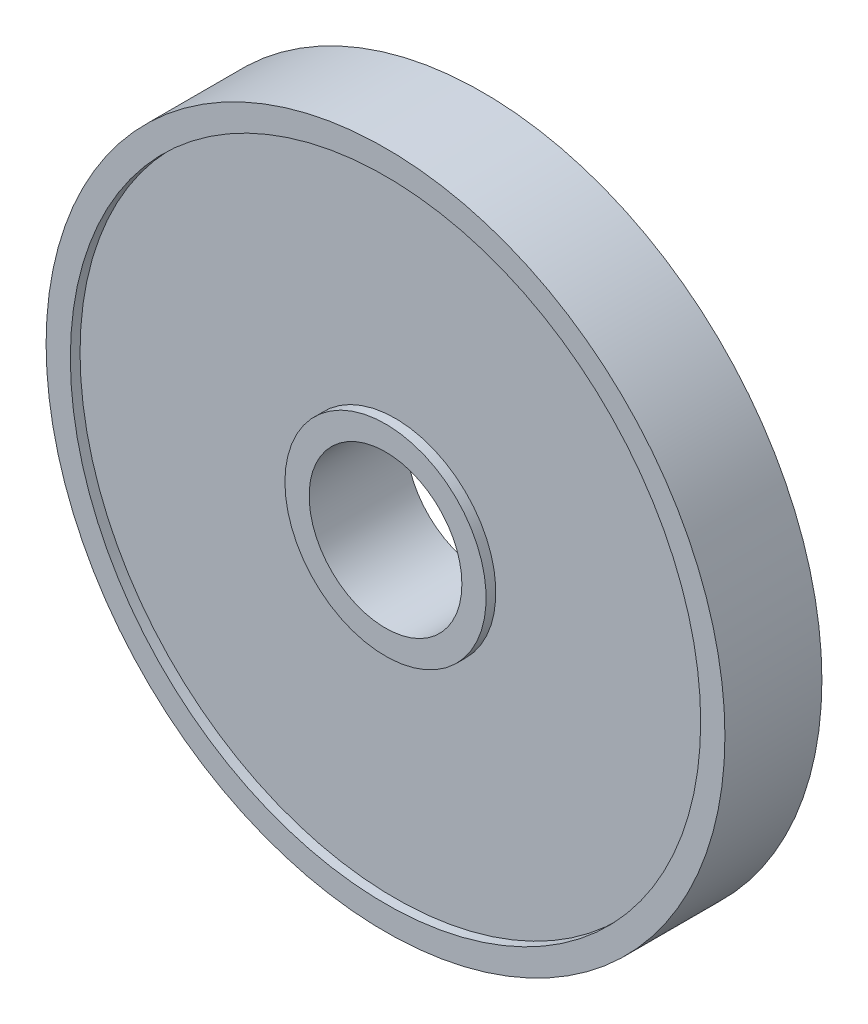
ISO-10303-21;
HEADER;
FILE_DESCRIPTION(('STEP AP214'),'2;1');
FILE_NAME('part.step','',(''),(''),'','','');
FILE_SCHEMA(('AUTOMOTIVE_DESIGN { 1 0 10303 214 1 1 1 1 }'));
ENDSEC;
DATA;
#1=APPLICATION_CONTEXT('core data for automotive mechanical design processes');
#2=APPLICATION_PROTOCOL_DEFINITION('international standard','automotive_design',2000,#1);
#3=PRODUCT_CONTEXT('',#1,'mechanical');
#4=PRODUCT('Part','Part','',(#3));
#5=PRODUCT_RELATED_PRODUCT_CATEGORY('part','',(#4));
#6=PRODUCT_DEFINITION_FORMATION('','',#4);
#7=PRODUCT_DEFINITION_CONTEXT('part definition',#1,'design');
#8=PRODUCT_DEFINITION('design','',#6,#7);
#9=PRODUCT_DEFINITION_SHAPE('','',#8);
#10=(LENGTH_UNIT() NAMED_UNIT(*) SI_UNIT(.MILLI.,.METRE.));
#11=(NAMED_UNIT(*) PLANE_ANGLE_UNIT() SI_UNIT($,.RADIAN.));
#12=(NAMED_UNIT(*) SI_UNIT($,.STERADIAN.) SOLID_ANGLE_UNIT());
#13=UNCERTAINTY_MEASURE_WITH_UNIT(LENGTH_MEASURE(1.E-05),#10,'distance_accuracy_value','');
#14=(GEOMETRIC_REPRESENTATION_CONTEXT(3) GLOBAL_UNCERTAINTY_ASSIGNED_CONTEXT((#13)) GLOBAL_UNIT_ASSIGNED_CONTEXT((#10,
#11,#12)) REPRESENTATION_CONTEXT('',''));
#15=CARTESIAN_POINT('',(0.,0.,0.));
#16=DIRECTION('',(0.,0.,1.));
#17=DIRECTION('',(1.,0.,0.));
#18=AXIS2_PLACEMENT_3D('',#15,#16,#17);
#19=CARTESIAN_POINT('',(0.,0.,20.));
#20=DIRECTION('',(0.,0.,1.));
#21=DIRECTION('',(1.,0.,0.));
#22=AXIS2_PLACEMENT_3D('',#19,#20,#21);
#23=PLANE('',#22);
#24=CARTESIAN_POINT('',(0.,0.,20.));
#25=DIRECTION('',(0.,0.,-1.));
#26=DIRECTION('',(-1.,0.,0.));
#27=AXIS2_PLACEMENT_3D('',#24,#25,#26);
#28=CIRCLE('',#27,20.75);
#29=CARTESIAN_POINT('',(-20.75,0.,20.));
#30=VERTEX_POINT('',#29);
#31=EDGE_CURVE('E51',#30,#30,#28,.T.);
#32=ORIENTED_EDGE('',*,*,#31,.F.);
#33=EDGE_LOOP('',(#32));
#34=FACE_BOUND('',#33,.T.);
#35=CARTESIAN_POINT('',(0.,0.,20.));
#36=DIRECTION('',(0.,0.,1.));
#37=DIRECTION('',(1.,0.,0.));
#38=AXIS2_PLACEMENT_3D('',#35,#36,#37);
#39=CIRCLE('',#38,15.75);
#40=CARTESIAN_POINT('',(15.75,0.,20.));
#41=VERTEX_POINT('',#40);
#42=EDGE_CURVE('E46',#41,#41,#39,.T.);
#43=ORIENTED_EDGE('',*,*,#42,.F.);
#44=EDGE_LOOP('',(#43));
#45=FACE_BOUND('',#44,.T.);
#46=ADVANCED_FACE('F32',(#34,#45),#23,.T.);
#47=CARTESIAN_POINT('',(0.,0.,0.));
#48=DIRECTION('',(0.,0.,1.));
#49=DIRECTION('',(1.,0.,0.));
#50=AXIS2_PLACEMENT_3D('',#47,#48,#49);
#51=PLANE('',#50);
#52=CARTESIAN_POINT('',(0.,0.,0.));
#53=DIRECTION('',(0.,0.,-1.));
#54=DIRECTION('',(-1.,0.,0.));
#55=AXIS2_PLACEMENT_3D('',#52,#53,#54);
#56=CIRCLE('',#55,20.75);
#57=CARTESIAN_POINT('',(-20.75,0.,0.));
#58=VERTEX_POINT('',#57);
#59=EDGE_CURVE('E59',#58,#58,#56,.T.);
#60=ORIENTED_EDGE('',*,*,#59,.T.);
#61=EDGE_LOOP('',(#60));
#62=FACE_BOUND('',#61,.T.);
#63=CARTESIAN_POINT('',(0.,0.,0.));
#64=DIRECTION('',(0.,0.,1.));
#65=DIRECTION('',(1.,0.,0.));
#66=AXIS2_PLACEMENT_3D('',#63,#64,#65);
#67=CIRCLE('',#66,15.75);
#68=CARTESIAN_POINT('',(15.75,0.,0.));
#69=VERTEX_POINT('',#68);
#70=EDGE_CURVE('E48',#69,#69,#67,.T.);
#71=ORIENTED_EDGE('',*,*,#70,.T.);
#72=EDGE_LOOP('',(#71));
#73=FACE_BOUND('',#72,.T.);
#74=ADVANCED_FACE('F91',(#62,#73),#51,.F.);
#75=CARTESIAN_POINT('',(0.,0.,20.));
#76=DIRECTION('',(0.,0.,-1.));
#77=DIRECTION('',(-1.,0.,0.));
#78=AXIS2_PLACEMENT_3D('',#75,#76,#77);
#79=CYLINDRICAL_SURFACE('',#78,15.75);
#80=ORIENTED_EDGE('',*,*,#42,.T.);
#81=EDGE_LOOP('',(#80));
#82=FACE_BOUND('',#81,.T.);
#83=ORIENTED_EDGE('',*,*,#70,.F.);
#84=EDGE_LOOP('',(#83));
#85=FACE_BOUND('',#84,.T.);
#86=ADVANCED_FACE('F96',(#82,#85),#79,.F.);
#87=CARTESIAN_POINT('',(0.,65.,2.));
#88=DIRECTION('',(0.,0.,1.));
#89=DIRECTION('',(1.,0.,0.));
#90=AXIS2_PLACEMENT_3D('',#87,#88,#89);
#91=PLANE('',#90);
#92=CARTESIAN_POINT('',(0.,0.,1.99999999999999));
#93=DIRECTION('',(0.,0.,-1.));
#94=DIRECTION('',(-1.,0.,0.));
#95=AXIS2_PLACEMENT_3D('',#92,#93,#94);
#96=CIRCLE('',#95,20.75);
#97=CARTESIAN_POINT('',(-20.75,0.,1.99999999999999));
#98=VERTEX_POINT('',#97);
#99=EDGE_CURVE('E55',#98,#98,#96,.T.);
#100=ORIENTED_EDGE('',*,*,#99,.F.);
#101=EDGE_LOOP('',(#100));
#102=FACE_BOUND('',#101,.T.);
#103=CARTESIAN_POINT('',(0.,0.,2.00000000000001));
#104=DIRECTION('',(0.,0.,-1.));
#105=DIRECTION('',(-1.,0.,0.));
#106=AXIS2_PLACEMENT_3D('',#103,#104,#105);
#107=CIRCLE('',#106,65.);
#108=CARTESIAN_POINT('',(-65.,0.,2.00000000000001));
#109=VERTEX_POINT('',#108);
#110=EDGE_CURVE('E65',#109,#109,#107,.T.);
#111=ORIENTED_EDGE('',*,*,#110,.T.);
#112=EDGE_LOOP('',(#111));
#113=FACE_BOUND('',#112,.T.);
#114=ADVANCED_FACE('F99',(#102,#113),#91,.F.);
#115=CARTESIAN_POINT('',(0.,0.,0.));
#116=DIRECTION('',(0.,0.,-1.));
#117=DIRECTION('',(-1.,0.,0.));
#118=AXIS2_PLACEMENT_3D('',#115,#116,#117);
#119=CYLINDRICAL_SURFACE('',#118,20.75);
#120=ORIENTED_EDGE('',*,*,#59,.F.);
#121=EDGE_LOOP('',(#120));
#122=FACE_BOUND('',#121,.T.);
#123=ORIENTED_EDGE('',*,*,#99,.T.);
#124=EDGE_LOOP('',(#123));
#125=FACE_BOUND('',#124,.T.);
#126=ADVANCED_FACE('F120',(#122,#125),#119,.T.);
#127=CARTESIAN_POINT('',(0.,0.,0.));
#128=DIRECTION('',(0.,0.,-1.));
#129=DIRECTION('',(-1.,0.,0.));
#130=AXIS2_PLACEMENT_3D('',#127,#128,#129);
#131=CYLINDRICAL_SURFACE('',#130,65.);
#132=ORIENTED_EDGE('',*,*,#110,.F.);
#133=EDGE_LOOP('',(#132));
#134=FACE_BOUND('',#133,.T.);
#135=CARTESIAN_POINT('',(0.,0.,0.));
#136=DIRECTION('',(0.,0.,-1.));
#137=DIRECTION('',(-1.,0.,0.));
#138=AXIS2_PLACEMENT_3D('',#135,#136,#137);
#139=CIRCLE('',#138,65.);
#140=CARTESIAN_POINT('',(-65.,0.,0.));
#141=VERTEX_POINT('',#140);
#142=EDGE_CURVE('E62',#141,#141,#139,.T.);
#143=ORIENTED_EDGE('',*,*,#142,.T.);
#144=EDGE_LOOP('',(#143));
#145=FACE_BOUND('',#144,.T.);
#146=ADVANCED_FACE('F85',(#134,#145),#131,.F.);
#147=CARTESIAN_POINT('',(0.,0.,0.));
#148=DIRECTION('',(0.,0.,-1.));
#149=DIRECTION('',(-1.,0.,0.));
#150=AXIS2_PLACEMENT_3D('',#147,#148,#149);
#151=CYLINDRICAL_SURFACE('',#150,20.75);
#152=CARTESIAN_POINT('',(0.,0.,18.));
#153=DIRECTION('',(0.,0.,-1.));
#154=DIRECTION('',(-1.,0.,0.));
#155=AXIS2_PLACEMENT_3D('',#152,#153,#154);
#156=CIRCLE('',#155,20.75);
#157=CARTESIAN_POINT('',(-20.75,0.,18.));
#158=VERTEX_POINT('',#157);
#159=EDGE_CURVE('E58',#158,#158,#156,.T.);
#160=ORIENTED_EDGE('',*,*,#159,.F.);
#161=EDGE_LOOP('',(#160));
#162=FACE_BOUND('',#161,.T.);
#163=ORIENTED_EDGE('',*,*,#31,.T.);
#164=EDGE_LOOP('',(#163));
#165=FACE_BOUND('',#164,.T.);
#166=ADVANCED_FACE('F81',(#162,#165),#151,.T.);
#167=CARTESIAN_POINT('',(0.,0.,0.));
#168=DIRECTION('',(0.,0.,-1.));
#169=DIRECTION('',(-1.,0.,0.));
#170=AXIS2_PLACEMENT_3D('',#167,#168,#169);
#171=CYLINDRICAL_SURFACE('',#170,65.);
#172=CARTESIAN_POINT('',(0.,0.,20.));
#173=DIRECTION('',(0.,0.,-1.));
#174=DIRECTION('',(-1.,0.,0.));
#175=AXIS2_PLACEMENT_3D('',#172,#173,#174);
#176=CIRCLE('',#175,65.);
#177=CARTESIAN_POINT('',(-65.,0.,20.));
#178=VERTEX_POINT('',#177);
#179=EDGE_CURVE('E70',#178,#178,#176,.T.);
#180=ORIENTED_EDGE('',*,*,#179,.F.);
#181=EDGE_LOOP('',(#180));
#182=FACE_BOUND('',#181,.T.);
#183=CARTESIAN_POINT('',(0.,0.,18.));
#184=DIRECTION('',(0.,0.,-1.));
#185=DIRECTION('',(-1.,0.,0.));
#186=AXIS2_PLACEMENT_3D('',#183,#184,#185);
#187=CIRCLE('',#186,65.);
#188=CARTESIAN_POINT('',(-65.,0.,18.));
#189=VERTEX_POINT('',#188);
#190=EDGE_CURVE('E73',#189,#189,#187,.T.);
#191=ORIENTED_EDGE('',*,*,#190,.T.);
#192=EDGE_LOOP('',(#191));
#193=FACE_BOUND('',#192,.T.);
#194=ADVANCED_FACE('F84',(#182,#193),#171,.F.);
#195=CARTESIAN_POINT('',(0.,65.,18.));
#196=DIRECTION('',(0.,0.,-1.));
#197=DIRECTION('',(-1.,0.,0.));
#198=AXIS2_PLACEMENT_3D('',#195,#196,#197);
#199=PLANE('',#198);
#200=ORIENTED_EDGE('',*,*,#190,.F.);
#201=EDGE_LOOP('',(#200));
#202=FACE_BOUND('',#201,.T.);
#203=ORIENTED_EDGE('',*,*,#159,.T.);
#204=EDGE_LOOP('',(#203));
#205=FACE_BOUND('',#204,.T.);
#206=ADVANCED_FACE('F79',(#202,#205),#199,.F.);
#207=ORIENTED_EDGE('',*,*,#179,.T.);
#208=EDGE_LOOP('',(#207));
#209=FACE_BOUND('',#208,.T.);
#210=CARTESIAN_POINT('',(0.,0.,20.));
#211=DIRECTION('',(0.,0.,1.));
#212=DIRECTION('',(1.,0.,0.));
#213=AXIS2_PLACEMENT_3D('',#210,#211,#212);
#214=CIRCLE('',#213,70.);
#215=CARTESIAN_POINT('',(70.,0.,20.));
#216=VERTEX_POINT('',#215);
#217=EDGE_CURVE('E10',#216,#216,#214,.T.);
#218=ORIENTED_EDGE('',*,*,#217,.T.);
#219=EDGE_LOOP('',(#218));
#220=FACE_BOUND('',#219,.T.);
#221=ADVANCED_FACE('F93',(#209,#220),#23,.T.);
#222=CARTESIAN_POINT('',(0.,0.,20.));
#223=DIRECTION('',(0.,0.,-1.));
#224=DIRECTION('',(-1.,0.,0.));
#225=AXIS2_PLACEMENT_3D('',#222,#223,#224);
#226=CYLINDRICAL_SURFACE('',#225,70.);
#227=ORIENTED_EDGE('',*,*,#217,.F.);
#228=EDGE_LOOP('',(#227));
#229=FACE_BOUND('',#228,.T.);
#230=CARTESIAN_POINT('',(0.,0.,0.));
#231=DIRECTION('',(0.,0.,1.));
#232=DIRECTION('',(1.,0.,0.));
#233=AXIS2_PLACEMENT_3D('',#230,#231,#232);
#234=CIRCLE('',#233,70.);
#235=CARTESIAN_POINT('',(70.,0.,0.));
#236=VERTEX_POINT('',#235);
#237=EDGE_CURVE('E36',#236,#236,#234,.T.);
#238=ORIENTED_EDGE('',*,*,#237,.T.);
#239=EDGE_LOOP('',(#238));
#240=FACE_BOUND('',#239,.T.);
#241=ADVANCED_FACE('F34',(#229,#240),#226,.T.);
#242=ORIENTED_EDGE('',*,*,#142,.F.);
#243=EDGE_LOOP('',(#242));
#244=FACE_BOUND('',#243,.T.);
#245=ORIENTED_EDGE('',*,*,#237,.F.);
#246=EDGE_LOOP('',(#245));
#247=FACE_BOUND('',#246,.T.);
#248=ADVANCED_FACE('F105',(#244,#247),#51,.F.);
#249=CLOSED_SHELL('',(#46,#74,#86,#114,#126,#146,#166,#194,#206,#221,#241,#248));
#250=MANIFOLD_SOLID_BREP('B2',#249);
#251=ADVANCED_BREP_SHAPE_REPRESENTATION('',(#18,#250),#14);
#252=SHAPE_DEFINITION_REPRESENTATION(#9,#251);
ENDSEC;
END-ISO-10303-21;
